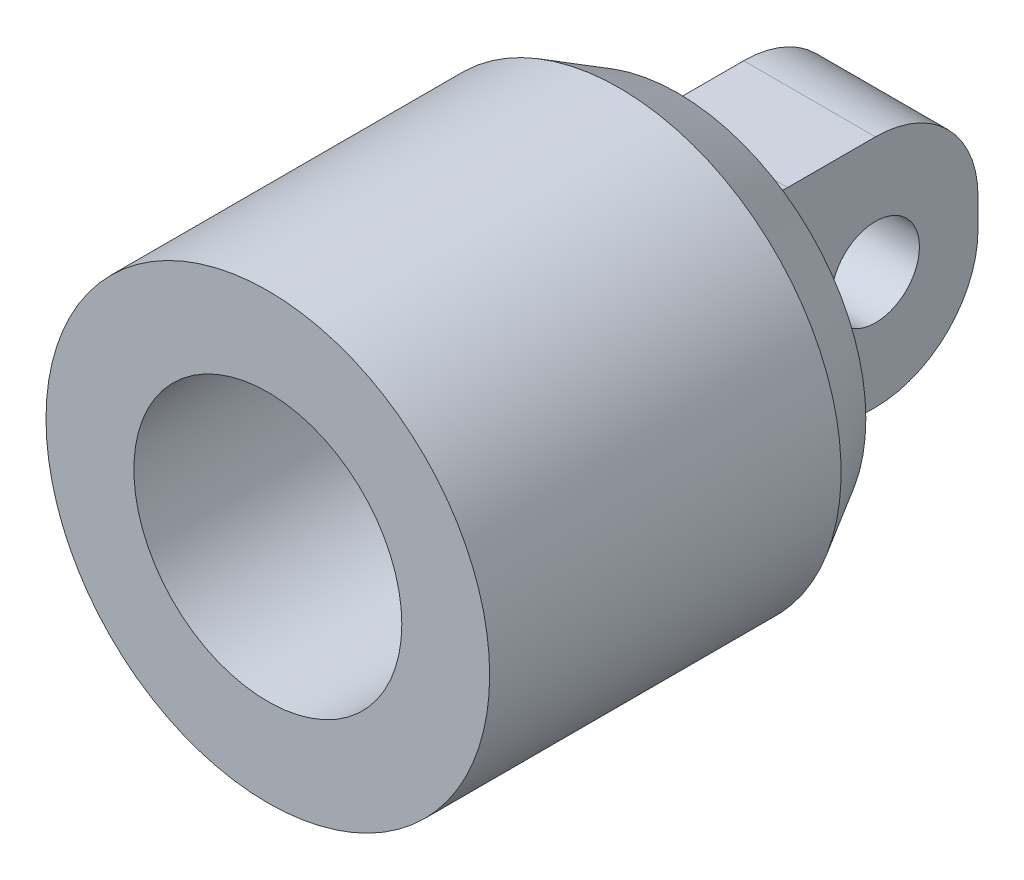
ISO-10303-21;
HEADER;
FILE_DESCRIPTION(('STEP AP214'),'2;1');
FILE_NAME('part.step','',(''),(''),'','','');
FILE_SCHEMA(('AUTOMOTIVE_DESIGN { 1 0 10303 214 1 1 1 1 }'));
ENDSEC;
DATA;
#1=APPLICATION_CONTEXT('core data for automotive mechanical design processes');
#2=APPLICATION_PROTOCOL_DEFINITION('international standard','automotive_design',2000,#1);
#3=PRODUCT_CONTEXT('',#1,'mechanical');
#4=PRODUCT('Part','Part','',(#3));
#5=PRODUCT_RELATED_PRODUCT_CATEGORY('part','',(#4));
#6=PRODUCT_DEFINITION_FORMATION('','',#4);
#7=PRODUCT_DEFINITION_CONTEXT('part definition',#1,'design');
#8=PRODUCT_DEFINITION('design','',#6,#7);
#9=PRODUCT_DEFINITION_SHAPE('','',#8);
#10=(LENGTH_UNIT() NAMED_UNIT(*) SI_UNIT(.MILLI.,.METRE.));
#11=(NAMED_UNIT(*) PLANE_ANGLE_UNIT() SI_UNIT($,.RADIAN.));
#12=(NAMED_UNIT(*) SI_UNIT($,.STERADIAN.) SOLID_ANGLE_UNIT());
#13=UNCERTAINTY_MEASURE_WITH_UNIT(LENGTH_MEASURE(1.E-05),#10,'distance_accuracy_value','');
#14=(GEOMETRIC_REPRESENTATION_CONTEXT(3) GLOBAL_UNCERTAINTY_ASSIGNED_CONTEXT((#13)) GLOBAL_UNIT_ASSIGNED_CONTEXT((#10,
#11,#12)) REPRESENTATION_CONTEXT('',''));
#15=CARTESIAN_POINT('',(0.,0.,0.));
#16=DIRECTION('',(0.,0.,1.));
#17=DIRECTION('',(1.,0.,0.));
#18=AXIS2_PLACEMENT_3D('',#15,#16,#17);
#19=CARTESIAN_POINT('',(0.,0.,-2.));
#20=DIRECTION('',(0.,0.,-1.));
#21=DIRECTION('',(-1.,0.,0.));
#22=AXIS2_PLACEMENT_3D('',#19,#20,#21);
#23=PLANE('',#22);
#24=CARTESIAN_POINT('',(0.,0.,-2.));
#25=DIRECTION('',(0.,0.,-1.));
#26=DIRECTION('',(-1.,0.,0.));
#27=AXIS2_PLACEMENT_3D('',#24,#25,#26);
#28=CIRCLE('',#27,6.42029946162075);
#29=CARTESIAN_POINT('',(-6.42029946162075,0.,-2.));
#30=VERTEX_POINT('',#29);
#31=EDGE_CURVE('E40',#30,#30,#28,.T.);
#32=ORIENTED_EDGE('',*,*,#31,.T.);
#33=EDGE_LOOP('',(#32));
#34=FACE_BOUND('',#33,.T.);
#35=DIRECTION('',(0.,-1.,0.));
#36=VECTOR('',#35,1.);
#37=CARTESIAN_POINT('',(-3.05,-5.5,-2.));
#38=LINE('',#37,#36);
#39=CARTESIAN_POINT('',(-3.05,5.5,-2.));
#40=VERTEX_POINT('',#39);
#41=CARTESIAN_POINT('',(-3.05,-5.5,-2.));
#42=VERTEX_POINT('',#41);
#43=EDGE_CURVE('E191',#40,#42,#38,.T.);
#44=ORIENTED_EDGE('',*,*,#43,.T.);
#45=DIRECTION('',(-1.,0.,0.));
#46=VECTOR('',#45,1.);
#47=CARTESIAN_POINT('',(0.,-5.5,-2.));
#48=LINE('',#47,#46);
#49=CARTESIAN_POINT('',(3.05,-5.5,-2.));
#50=VERTEX_POINT('',#49);
#51=EDGE_CURVE('E177',#42,#50,#48,.F.);
#52=ORIENTED_EDGE('',*,*,#51,.T.);
#53=DIRECTION('',(0.,-1.,0.));
#54=VECTOR('',#53,1.);
#55=CARTESIAN_POINT('',(3.05,0.,-2.));
#56=LINE('',#55,#54);
#57=CARTESIAN_POINT('',(3.05,5.5,-2.));
#58=VERTEX_POINT('',#57);
#59=EDGE_CURVE('E188',#50,#58,#56,.F.);
#60=ORIENTED_EDGE('',*,*,#59,.T.);
#61=DIRECTION('',(-1.,0.,0.));
#62=VECTOR('',#61,1.);
#63=CARTESIAN_POINT('',(0.,5.5,-2.));
#64=LINE('',#63,#62);
#65=EDGE_CURVE('E175',#58,#40,#64,.T.);
#66=ORIENTED_EDGE('',*,*,#65,.T.);
#67=EDGE_LOOP('',(#44,#52,#60,#66));
#68=FACE_BOUND('',#67,.T.);
#69=ADVANCED_FACE('F32',(#34,#68),#23,.T.);
#70=CARTESIAN_POINT('',(0.,0.,12.));
#71=DIRECTION('',(0.,0.,1.));
#72=DIRECTION('',(1.,0.,0.));
#73=AXIS2_PLACEMENT_3D('',#70,#71,#72);
#74=PLANE('',#73);
#75=CARTESIAN_POINT('',(0.,0.,12.));
#76=DIRECTION('',(0.,0.,1.));
#77=DIRECTION('',(1.,0.,0.));
#78=AXIS2_PLACEMENT_3D('',#75,#76,#77);
#79=CIRCLE('',#78,7.575);
#80=CARTESIAN_POINT('',(7.575,0.,12.));
#81=VERTEX_POINT('',#80);
#82=EDGE_CURVE('E133',#81,#81,#79,.T.);
#83=ORIENTED_EDGE('',*,*,#82,.T.);
#84=EDGE_LOOP('',(#83));
#85=FACE_BOUND('',#84,.T.);
#86=CARTESIAN_POINT('',(0.,0.,12.));
#87=DIRECTION('',(0.,0.,1.));
#88=DIRECTION('',(1.,0.,0.));
#89=AXIS2_PLACEMENT_3D('',#86,#87,#88);
#90=CIRCLE('',#89,4.575);
#91=CARTESIAN_POINT('',(4.575,0.,12.));
#92=VERTEX_POINT('',#91);
#93=EDGE_CURVE('E148',#92,#92,#90,.T.);
#94=ORIENTED_EDGE('',*,*,#93,.F.);
#95=EDGE_LOOP('',(#94));
#96=FACE_BOUND('',#95,.T.);
#97=ADVANCED_FACE('F245',(#85,#96),#74,.T.);
#98=CARTESIAN_POINT('',(0.,0.,12.));
#99=DIRECTION('',(0.,0.,-1.));
#100=DIRECTION('',(-1.,0.,0.));
#101=AXIS2_PLACEMENT_3D('',#98,#99,#100);
#102=CYLINDRICAL_SURFACE('',#101,7.575);
#103=CARTESIAN_POINT('',(0.,0.,0.));
#104=DIRECTION('',(0.,0.,-1.));
#105=DIRECTION('',(-1.,0.,0.));
#106=AXIS2_PLACEMENT_3D('',#103,#104,#105);
#107=CIRCLE('',#106,7.575);
#108=CARTESIAN_POINT('',(-7.575,0.,0.));
#109=VERTEX_POINT('',#108);
#110=EDGE_CURVE('E11',#109,#109,#107,.F.);
#111=ORIENTED_EDGE('',*,*,#110,.T.);
#112=EDGE_LOOP('',(#111));
#113=FACE_BOUND('',#112,.T.);
#114=ORIENTED_EDGE('',*,*,#82,.F.);
#115=EDGE_LOOP('',(#114));
#116=FACE_BOUND('',#115,.T.);
#117=ADVANCED_FACE('F251',(#113,#116),#102,.T.);
#118=CARTESIAN_POINT('',(0.,0.,12.));
#119=DIRECTION('',(0.,0.,-1.));
#120=DIRECTION('',(-1.,0.,0.));
#121=AXIS2_PLACEMENT_3D('',#118,#119,#120);
#122=CYLINDRICAL_SURFACE('',#121,4.575);
#123=ORIENTED_EDGE('',*,*,#93,.T.);
#124=EDGE_LOOP('',(#123));
#125=FACE_BOUND('',#124,.T.);
#126=CARTESIAN_POINT('',(0.,0.,0.));
#127=DIRECTION('',(0.,0.,1.));
#128=DIRECTION('',(1.,0.,0.));
#129=AXIS2_PLACEMENT_3D('',#126,#127,#128);
#130=CIRCLE('',#129,4.575);
#131=CARTESIAN_POINT('',(4.575,0.,0.));
#132=VERTEX_POINT('',#131);
#133=EDGE_CURVE('E151',#132,#132,#130,.T.);
#134=ORIENTED_EDGE('',*,*,#133,.F.);
#135=EDGE_LOOP('',(#134));
#136=FACE_BOUND('',#135,.T.);
#137=ADVANCED_FACE('F263',(#125,#136),#122,.F.);
#138=CARTESIAN_POINT('',(0.,0.,0.));
#139=DIRECTION('',(0.,0.,-1.));
#140=DIRECTION('',(-1.,0.,0.));
#141=AXIS2_PLACEMENT_3D('',#138,#139,#140);
#142=PLANE('',#141);
#143=ORIENTED_EDGE('',*,*,#133,.T.);
#144=EDGE_LOOP('',(#143));
#145=FACE_BOUND('',#144,.T.);
#146=ADVANCED_FACE('F260',(#145),#142,.F.);
#147=CARTESIAN_POINT('',(2.25,-4.,-10.));
#148=DIRECTION('',(0.,1.,0.));
#149=DIRECTION('',(0.,0.,1.));
#150=AXIS2_PLACEMENT_3D('',#147,#148,#149);
#151=PLANE('',#150);
#152=DIRECTION('',(0.,0.,-1.));
#153=VECTOR('',#152,1.);
#154=CARTESIAN_POINT('',(2.25,-4.,-10.));
#155=LINE('',#154,#153);
#156=CARTESIAN_POINT('',(2.25,-4.,-3.5));
#157=VERTEX_POINT('',#156);
#158=CARTESIAN_POINT('',(2.25,-4.,-6.5));
#159=VERTEX_POINT('',#158);
#160=EDGE_CURVE('E139',#157,#159,#155,.T.);
#161=ORIENTED_EDGE('',*,*,#160,.F.);
#162=DIRECTION('',(-1.,0.,0.));
#163=VECTOR('',#162,1.);
#164=CARTESIAN_POINT('',(2.25,-4.,-3.5));
#165=LINE('',#164,#163);
#166=CARTESIAN_POINT('',(-2.25,-4.,-3.5));
#167=VERTEX_POINT('',#166);
#168=EDGE_CURVE('E172',#157,#167,#165,.T.);
#169=ORIENTED_EDGE('',*,*,#168,.T.);
#170=DIRECTION('',(0.,0.,-1.));
#171=VECTOR('',#170,1.);
#172=CARTESIAN_POINT('',(-2.25,-4.,-10.));
#173=LINE('',#172,#171);
#174=CARTESIAN_POINT('',(-2.25,-4.,-6.5));
#175=VERTEX_POINT('',#174);
#176=EDGE_CURVE('E144',#167,#175,#173,.T.);
#177=ORIENTED_EDGE('',*,*,#176,.T.);
#178=DIRECTION('',(-1.,0.,0.));
#179=VECTOR('',#178,1.);
#180=CARTESIAN_POINT('',(2.25,-4.,-6.5));
#181=LINE('',#180,#179);
#182=EDGE_CURVE('E169',#175,#159,#181,.F.);
#183=ORIENTED_EDGE('',*,*,#182,.T.);
#184=EDGE_LOOP('',(#161,#169,#177,#183));
#185=FACE_BOUND('',#184,.T.);
#186=ADVANCED_FACE('F258',(#185),#151,.F.);
#187=CARTESIAN_POINT('',(2.25,4.,-10.));
#188=DIRECTION('',(0.,0.,1.));
#189=DIRECTION('',(1.,0.,0.));
#190=AXIS2_PLACEMENT_3D('',#187,#188,#189);
#191=PLANE('',#190);
#192=DIRECTION('',(0.,1.,0.));
#193=VECTOR('',#192,1.);
#194=CARTESIAN_POINT('',(-2.25,4.,-10.));
#195=LINE('',#194,#193);
#196=CARTESIAN_POINT('',(-2.25,-0.5,-10.));
#197=VERTEX_POINT('',#196);
#198=CARTESIAN_POINT('',(-2.25,0.500000000000001,-10.));
#199=VERTEX_POINT('',#198);
#200=EDGE_CURVE('E140',#197,#199,#195,.T.);
#201=ORIENTED_EDGE('',*,*,#200,.T.);
#202=DIRECTION('',(-1.,0.,0.));
#203=VECTOR('',#202,1.);
#204=CARTESIAN_POINT('',(2.25,0.500000000000001,-10.));
#205=LINE('',#204,#203);
#206=CARTESIAN_POINT('',(2.25,0.500000000000001,-10.));
#207=VERTEX_POINT('',#206);
#208=EDGE_CURVE('E117',#199,#207,#205,.F.);
#209=ORIENTED_EDGE('',*,*,#208,.T.);
#210=DIRECTION('',(0.,1.,0.));
#211=VECTOR('',#210,1.);
#212=CARTESIAN_POINT('',(2.25,4.,-10.));
#213=LINE('',#212,#211);
#214=CARTESIAN_POINT('',(2.25,-0.5,-10.));
#215=VERTEX_POINT('',#214);
#216=EDGE_CURVE('E142',#215,#207,#213,.T.);
#217=ORIENTED_EDGE('',*,*,#216,.F.);
#218=DIRECTION('',(-1.,0.,0.));
#219=VECTOR('',#218,1.);
#220=CARTESIAN_POINT('',(2.25,-0.5,-10.));
#221=LINE('',#220,#219);
#222=EDGE_CURVE('E122',#215,#197,#221,.T.);
#223=ORIENTED_EDGE('',*,*,#222,.T.);
#224=EDGE_LOOP('',(#201,#209,#217,#223));
#225=FACE_BOUND('',#224,.T.);
#226=ADVANCED_FACE('F291',(#225),#191,.F.);
#227=CARTESIAN_POINT('',(2.25,4.,-2.));
#228=DIRECTION('',(0.,-1.,0.));
#229=DIRECTION('',(0.,0.,-1.));
#230=AXIS2_PLACEMENT_3D('',#227,#228,#229);
#231=PLANE('',#230);
#232=DIRECTION('',(0.,0.,1.));
#233=VECTOR('',#232,1.);
#234=CARTESIAN_POINT('',(-2.25,4.,-2.));
#235=LINE('',#234,#233);
#236=CARTESIAN_POINT('',(-2.25,4.,-6.5));
#237=VERTEX_POINT('',#236);
#238=CARTESIAN_POINT('',(-2.25,4.,-3.5));
#239=VERTEX_POINT('',#238);
#240=EDGE_CURVE('E129',#237,#239,#235,.T.);
#241=ORIENTED_EDGE('',*,*,#240,.T.);
#242=DIRECTION('',(-1.,0.,0.));
#243=VECTOR('',#242,1.);
#244=CARTESIAN_POINT('',(2.25,4.,-3.5));
#245=LINE('',#244,#243);
#246=CARTESIAN_POINT('',(2.25,4.,-3.5));
#247=VERTEX_POINT('',#246);
#248=EDGE_CURVE('E179',#239,#247,#245,.F.);
#249=ORIENTED_EDGE('',*,*,#248,.T.);
#250=DIRECTION('',(0.,0.,1.));
#251=VECTOR('',#250,1.);
#252=CARTESIAN_POINT('',(2.25,4.,-2.));
#253=LINE('',#252,#251);
#254=CARTESIAN_POINT('',(2.25,4.,-6.5));
#255=VERTEX_POINT('',#254);
#256=EDGE_CURVE('E132',#255,#247,#253,.T.);
#257=ORIENTED_EDGE('',*,*,#256,.F.);
#258=DIRECTION('',(-1.,0.,0.));
#259=VECTOR('',#258,1.);
#260=CARTESIAN_POINT('',(2.25,4.,-6.5));
#261=LINE('',#260,#259);
#262=EDGE_CURVE('E116',#255,#237,#261,.T.);
#263=ORIENTED_EDGE('',*,*,#262,.T.);
#264=EDGE_LOOP('',(#241,#249,#257,#263));
#265=FACE_BOUND('',#264,.T.);
#266=ADVANCED_FACE('F128',(#265),#231,.F.);
#267=CARTESIAN_POINT('',(2.25,0.,0.));
#268=DIRECTION('',(-1.,0.,0.));
#269=DIRECTION('',(0.,0.,1.));
#270=AXIS2_PLACEMENT_3D('',#267,#268,#269);
#271=PLANE('',#270);
#272=CARTESIAN_POINT('',(2.25,0.,-6.5));
#273=DIRECTION('',(1.,0.,0.));
#274=DIRECTION('',(0.,0.,-1.));
#275=AXIS2_PLACEMENT_3D('',#272,#273,#274);
#276=CIRCLE('',#275,1.5);
#277=CARTESIAN_POINT('',(2.25,0.,-8.));
#278=VERTEX_POINT('',#277);
#279=EDGE_CURVE('E158',#278,#278,#276,.T.);
#280=ORIENTED_EDGE('',*,*,#279,.F.);
#281=EDGE_LOOP('',(#280));
#282=FACE_BOUND('',#281,.T.);
#283=CARTESIAN_POINT('',(2.25,5.5,-3.5));
#284=DIRECTION('',(-1.,0.,0.));
#285=DIRECTION('',(0.,0.,1.));
#286=AXIS2_PLACEMENT_3D('',#283,#284,#285);
#287=CIRCLE('',#286,1.5);
#288=CARTESIAN_POINT('',(2.25,4.17335008385784,-2.8));
#289=VERTEX_POINT('',#288);
#290=EDGE_CURVE('E186',#247,#289,#287,.T.);
#291=ORIENTED_EDGE('',*,*,#290,.T.);
#292=DIRECTION('',(0.,-1.,0.));
#293=VECTOR('',#292,1.);
#294=CARTESIAN_POINT('',(2.25,0.,-2.8));
#295=LINE('',#294,#293);
#296=CARTESIAN_POINT('',(2.25,-4.17335008385784,-2.8));
#297=VERTEX_POINT('',#296);
#298=EDGE_CURVE('E196',#289,#297,#295,.T.);
#299=ORIENTED_EDGE('',*,*,#298,.T.);
#300=CARTESIAN_POINT('',(2.25,-5.5,-3.5));
#301=DIRECTION('',(-1.,0.,0.));
#302=DIRECTION('',(0.,0.,1.));
#303=AXIS2_PLACEMENT_3D('',#300,#301,#302);
#304=CIRCLE('',#303,1.5);
#305=EDGE_CURVE('E183',#297,#157,#304,.T.);
#306=ORIENTED_EDGE('',*,*,#305,.T.);
#307=ORIENTED_EDGE('',*,*,#160,.T.);
#308=CARTESIAN_POINT('',(2.25,-0.5,-6.5));
#309=DIRECTION('',(-1.,0.,0.));
#310=DIRECTION('',(0.,0.,1.));
#311=AXIS2_PLACEMENT_3D('',#308,#309,#310);
#312=CIRCLE('',#311,3.5);
#313=EDGE_CURVE('E165',#159,#215,#312,.F.);
#314=ORIENTED_EDGE('',*,*,#313,.T.);
#315=ORIENTED_EDGE('',*,*,#216,.T.);
#316=CARTESIAN_POINT('',(2.25,0.500000000000001,-6.5));
#317=DIRECTION('',(-1.,0.,0.));
#318=DIRECTION('',(0.,0.,1.));
#319=AXIS2_PLACEMENT_3D('',#316,#317,#318);
#320=CIRCLE('',#319,3.5);
#321=EDGE_CURVE('E167',#207,#255,#320,.F.);
#322=ORIENTED_EDGE('',*,*,#321,.T.);
#323=ORIENTED_EDGE('',*,*,#256,.T.);
#324=EDGE_LOOP('',(#291,#299,#306,#307,#314,#315,#322,#323));
#325=FACE_BOUND('',#324,.T.);
#326=ADVANCED_FACE('F282',(#282,#325),#271,.F.);
#327=CARTESIAN_POINT('',(-2.25,0.,0.));
#328=DIRECTION('',(-1.,0.,0.));
#329=DIRECTION('',(0.,0.,1.));
#330=AXIS2_PLACEMENT_3D('',#327,#328,#329);
#331=PLANE('',#330);
#332=CARTESIAN_POINT('',(-2.25,0.,-6.5));
#333=DIRECTION('',(-1.,0.,0.));
#334=DIRECTION('',(0.,0.,1.));
#335=AXIS2_PLACEMENT_3D('',#332,#333,#334);
#336=CIRCLE('',#335,1.5);
#337=CARTESIAN_POINT('',(-2.25,0.,-5.));
#338=VERTEX_POINT('',#337);
#339=EDGE_CURVE('E156',#338,#338,#336,.T.);
#340=ORIENTED_EDGE('',*,*,#339,.F.);
#341=EDGE_LOOP('',(#340));
#342=FACE_BOUND('',#341,.T.);
#343=CARTESIAN_POINT('',(-2.25,-5.5,-3.5));
#344=DIRECTION('',(-1.,0.,0.));
#345=DIRECTION('',(0.,0.,1.));
#346=AXIS2_PLACEMENT_3D('',#343,#344,#345);
#347=CIRCLE('',#346,1.5);
#348=CARTESIAN_POINT('',(-2.25,-4.17335008385784,-2.8));
#349=VERTEX_POINT('',#348);
#350=EDGE_CURVE('E181',#167,#349,#347,.F.);
#351=ORIENTED_EDGE('',*,*,#350,.T.);
#352=DIRECTION('',(0.,-1.,0.));
#353=VECTOR('',#352,1.);
#354=CARTESIAN_POINT('',(-2.25,5.5,-2.8));
#355=LINE('',#354,#353);
#356=CARTESIAN_POINT('',(-2.25,4.17335008385784,-2.8));
#357=VERTEX_POINT('',#356);
#358=EDGE_CURVE('E194',#349,#357,#355,.F.);
#359=ORIENTED_EDGE('',*,*,#358,.T.);
#360=CARTESIAN_POINT('',(-2.25,5.5,-3.5));
#361=DIRECTION('',(-1.,0.,0.));
#362=DIRECTION('',(0.,0.,1.));
#363=AXIS2_PLACEMENT_3D('',#360,#361,#362);
#364=CIRCLE('',#363,1.5);
#365=EDGE_CURVE('E138',#357,#239,#364,.F.);
#366=ORIENTED_EDGE('',*,*,#365,.T.);
#367=ORIENTED_EDGE('',*,*,#240,.F.);
#368=CARTESIAN_POINT('',(-2.25,0.500000000000001,-6.5));
#369=DIRECTION('',(-1.,0.,0.));
#370=DIRECTION('',(0.,0.,1.));
#371=AXIS2_PLACEMENT_3D('',#368,#369,#370);
#372=CIRCLE('',#371,3.5);
#373=EDGE_CURVE('E112',#237,#199,#372,.T.);
#374=ORIENTED_EDGE('',*,*,#373,.T.);
#375=ORIENTED_EDGE('',*,*,#200,.F.);
#376=CARTESIAN_POINT('',(-2.25,-0.5,-6.5));
#377=DIRECTION('',(-1.,0.,0.));
#378=DIRECTION('',(0.,0.,1.));
#379=AXIS2_PLACEMENT_3D('',#376,#377,#378);
#380=CIRCLE('',#379,3.5);
#381=EDGE_CURVE('E123',#197,#175,#380,.T.);
#382=ORIENTED_EDGE('',*,*,#381,.T.);
#383=ORIENTED_EDGE('',*,*,#176,.F.);
#384=EDGE_LOOP('',(#351,#359,#366,#367,#374,#375,#382,#383));
#385=FACE_BOUND('',#384,.T.);
#386=ADVANCED_FACE('F136',(#342,#385),#331,.T.);
#387=CARTESIAN_POINT('',(-7.575,0.,-6.5));
#388=DIRECTION('',(1.,0.,0.));
#389=DIRECTION('',(0.,0.,-1.));
#390=AXIS2_PLACEMENT_3D('',#387,#388,#389);
#391=CYLINDRICAL_SURFACE('',#390,1.5);
#392=ORIENTED_EDGE('',*,*,#339,.T.);
#393=EDGE_LOOP('',(#392));
#394=FACE_BOUND('',#393,.T.);
#395=ORIENTED_EDGE('',*,*,#279,.T.);
#396=EDGE_LOOP('',(#395));
#397=FACE_BOUND('',#396,.T.);
#398=ADVANCED_FACE('F271',(#394,#397),#391,.F.);
#399=CARTESIAN_POINT('',(2.25,0.500000000000001,-6.5));
#400=DIRECTION('',(-1.,0.,0.));
#401=DIRECTION('',(0.,0.,1.));
#402=AXIS2_PLACEMENT_3D('',#399,#400,#401);
#403=CYLINDRICAL_SURFACE('',#402,3.5);
#404=ORIENTED_EDGE('',*,*,#321,.F.);
#405=ORIENTED_EDGE('',*,*,#208,.F.);
#406=ORIENTED_EDGE('',*,*,#373,.F.);
#407=ORIENTED_EDGE('',*,*,#262,.F.);
#408=EDGE_LOOP('',(#404,#405,#406,#407));
#409=FACE_BOUND('',#408,.T.);
#410=ADVANCED_FACE('F115',(#409),#403,.T.);
#411=CARTESIAN_POINT('',(2.25,-0.5,-6.5));
#412=DIRECTION('',(-1.,0.,0.));
#413=DIRECTION('',(0.,0.,1.));
#414=AXIS2_PLACEMENT_3D('',#411,#412,#413);
#415=CYLINDRICAL_SURFACE('',#414,3.5);
#416=ORIENTED_EDGE('',*,*,#313,.F.);
#417=ORIENTED_EDGE('',*,*,#182,.F.);
#418=ORIENTED_EDGE('',*,*,#381,.F.);
#419=ORIENTED_EDGE('',*,*,#222,.F.);
#420=EDGE_LOOP('',(#416,#417,#418,#419));
#421=FACE_BOUND('',#420,.T.);
#422=ADVANCED_FACE('F220',(#421),#415,.T.);
#423=CARTESIAN_POINT('',(2.25,-5.5,-3.5));
#424=DIRECTION('',(-1.,0.,0.));
#425=DIRECTION('',(0.,0.,1.));
#426=AXIS2_PLACEMENT_3D('',#423,#424,#425);
#427=CYLINDRICAL_SURFACE('',#426,1.5);
#428=ORIENTED_EDGE('',*,*,#305,.F.);
#429=CARTESIAN_POINT('',(2.25,-4.17335008385784,-2.8));
#430=CARTESIAN_POINT('',(2.24999970846345,-4.18653906857599,-2.77499444108757));
#431=CARTESIAN_POINT('',(2.25117201737374,-4.2004300415766,-2.75039082358349));
#432=CARTESIAN_POINT('',(2.25563441343226,-4.22945817422937,-2.70218375675026));
#433=CARTESIAN_POINT('',(2.25892083972887,-4.24459314031614,-2.67857865353232));
#434=CARTESIAN_POINT('',(2.27152694613575,-4.29136262622054,-2.60992263431384));
#435=CARTESIAN_POINT('',(2.28360353892915,-4.32465089762547,-2.56648780286273));
#436=CARTESIAN_POINT('',(2.31795752867752,-4.40504616907569,-2.47239308749919));
#437=CARTESIAN_POINT('',(2.34220676928859,-4.45330596117375,-2.42346526488911));
#438=CARTESIAN_POINT('',(2.39757026672099,-4.55390009328018,-2.33404225581291));
#439=CARTESIAN_POINT('',(2.42872066481805,-4.60625490870792,-2.2935937301803));
#440=CARTESIAN_POINT('',(2.50935008352192,-4.73544693607746,-2.20625760601271));
#441=CARTESIAN_POINT('',(2.56113209177665,-4.81358440602729,-2.16343721989299));
#442=CARTESIAN_POINT('',(2.67000954596476,-4.97273604374257,-2.09302820798627));
#443=CARTESIAN_POINT('',(2.72710454589373,-5.05374996968856,-2.06543830500659));
#444=CARTESIAN_POINT('',(2.82795474250742,-5.1947295535853,-2.03012403237722));
#445=CARTESIAN_POINT('',(2.87105782349024,-5.25435322473934,-2.01902241366479));
#446=CARTESIAN_POINT('',(2.95792485726329,-5.37391137822492,-2.00409787590262));
#447=CARTESIAN_POINT('',(3.00168757598934,-5.43384516875054,-2.00026274069123));
#448=CARTESIAN_POINT('',(3.04695448378584,-5.49582975400963,-2.00000435120864));
#449=CARTESIAN_POINT('',(3.04847726127759,-5.49791490289666,-2.00000000385586));
#450=CARTESIAN_POINT('',(3.05,-5.5,-2.));
#451=B_SPLINE_CURVE_WITH_KNOTS('',3,(#429,#430,#431,#432,#433,#434,#435,#436,#437,#438,#439,
#440,#441,#442,#443,#444,#445,#446,#447,#448,#449,#450),.UNSPECIFIED.,.F.,.F.,(4,2,2,2,2,2,2,2,
2,2,4),(0.,0.084730965607158,0.16931560274699,0.336665682299699,0.554135768414899,
0.772772859277625,1.08029328658109,1.38778792202223,1.61067470146313,1.83318643770084,
1.84093241537538),.UNSPECIFIED.);
#452=EDGE_CURVE('E47',#297,#50,#451,.T.);
#453=ORIENTED_EDGE('',*,*,#452,.T.);
#454=ORIENTED_EDGE('',*,*,#51,.F.);
#455=CARTESIAN_POINT('',(-2.25,-4.17335008385784,-2.8));
#456=CARTESIAN_POINT('',(-2.24999970846345,-4.18653906857599,-2.77499444108757));
#457=CARTESIAN_POINT('',(-2.25117201737374,-4.2004300415766,-2.75039082358349));
#458=CARTESIAN_POINT('',(-2.25563441343226,-4.22945817422937,-2.70218375675026));
#459=CARTESIAN_POINT('',(-2.25892083972887,-4.24459314031614,-2.67857865353232));
#460=CARTESIAN_POINT('',(-2.27152694613575,-4.29136262622054,-2.60992263431384));
#461=CARTESIAN_POINT('',(-2.28360353892915,-4.32465089762547,-2.56648780286273));
#462=CARTESIAN_POINT('',(-2.31795752867752,-4.40504616907569,-2.47239308749919));
#463=CARTESIAN_POINT('',(-2.34220676928859,-4.45330596117375,-2.42346526488911));
#464=CARTESIAN_POINT('',(-2.39757026672099,-4.55390009328018,-2.33404225581291));
#465=CARTESIAN_POINT('',(-2.42872066481805,-4.60625490870792,-2.2935937301803));
#466=CARTESIAN_POINT('',(-2.50935008352192,-4.73544693607746,-2.20625760601271));
#467=CARTESIAN_POINT('',(-2.56113209177665,-4.81358440602729,-2.16343721989299));
#468=CARTESIAN_POINT('',(-2.67000954596476,-4.97273604374257,-2.09302820798627));
#469=CARTESIAN_POINT('',(-2.72710454589373,-5.05374996968856,-2.06543830500659));
#470=CARTESIAN_POINT('',(-2.82795474250742,-5.1947295535853,-2.03012403237722));
#471=CARTESIAN_POINT('',(-2.87105782349024,-5.25435322473934,-2.01902241366479));
#472=CARTESIAN_POINT('',(-2.95792485726329,-5.37391137822492,-2.00409787590262));
#473=CARTESIAN_POINT('',(-3.00168757598934,-5.43384516875054,-2.00026274069123));
#474=CARTESIAN_POINT('',(-3.04695448378584,-5.49582975400963,-2.00000435120864));
#475=CARTESIAN_POINT('',(-3.04847726127759,-5.49791490289666,-2.00000000385586));
#476=CARTESIAN_POINT('',(-3.05,-5.5,-2.));
#477=B_SPLINE_CURVE_WITH_KNOTS('',3,(#455,#456,#457,#458,#459,#460,#461,#462,#463,#464,#465,
#466,#467,#468,#469,#470,#471,#472,#473,#474,#475,#476),.UNSPECIFIED.,.F.,.F.,(4,2,2,2,2,2,2,2,
2,2,4),(0.,0.084730965607158,0.16931560274699,0.336665682299699,0.554135768414899,
0.772772859277625,1.08029328658109,1.38778792202223,1.61067470146313,1.83318643770084,
1.84093241537538),.UNSPECIFIED.);
#478=EDGE_CURVE('E198',#42,#349,#477,.F.);
#479=ORIENTED_EDGE('',*,*,#478,.T.);
#480=ORIENTED_EDGE('',*,*,#350,.F.);
#481=ORIENTED_EDGE('',*,*,#168,.F.);
#482=EDGE_LOOP('',(#428,#453,#454,#479,#480,#481));
#483=FACE_BOUND('',#482,.T.);
#484=ADVANCED_FACE('F215',(#483),#427,.F.);
#485=CARTESIAN_POINT('',(0.,5.5,-3.5));
#486=DIRECTION('',(-1.,0.,0.));
#487=DIRECTION('',(0.,0.,1.));
#488=AXIS2_PLACEMENT_3D('',#485,#486,#487);
#489=CYLINDRICAL_SURFACE('',#488,1.5);
#490=ORIENTED_EDGE('',*,*,#290,.F.);
#491=ORIENTED_EDGE('',*,*,#248,.F.);
#492=ORIENTED_EDGE('',*,*,#365,.F.);
#493=CARTESIAN_POINT('',(-2.25,4.17335008385784,-2.8));
#494=CARTESIAN_POINT('',(-2.24999970846345,4.18653906857599,-2.77499444108757));
#495=CARTESIAN_POINT('',(-2.25117201737374,4.2004300415766,-2.75039082358349));
#496=CARTESIAN_POINT('',(-2.25563441343226,4.22945817422937,-2.70218375675027));
#497=CARTESIAN_POINT('',(-2.25892083972887,4.24459314031614,-2.67857865353232));
#498=CARTESIAN_POINT('',(-2.27152694613575,4.29136262622054,-2.60992263431385));
#499=CARTESIAN_POINT('',(-2.28360353892915,4.32465089762547,-2.56648780286274));
#500=CARTESIAN_POINT('',(-2.31795752867752,4.40504616907569,-2.47239308749919));
#501=CARTESIAN_POINT('',(-2.3422067692886,4.45330596117375,-2.4234652648891));
#502=CARTESIAN_POINT('',(-2.39757026672099,4.55390009328018,-2.33404225581291));
#503=CARTESIAN_POINT('',(-2.42872066481805,4.60625490870793,-2.2935937301803));
#504=CARTESIAN_POINT('',(-2.50935008352192,4.73544693607746,-2.20625760601271));
#505=CARTESIAN_POINT('',(-2.56113209177666,4.81358440602728,-2.16343721989299));
#506=CARTESIAN_POINT('',(-2.67000954596474,4.97273604374258,-2.09302820798627));
#507=CARTESIAN_POINT('',(-2.72710454589367,5.0537499696886,-2.06543830500659));
#508=CARTESIAN_POINT('',(-2.82795474250746,5.19472955358527,-2.03012403237722));
#509=CARTESIAN_POINT('',(-2.87105782349038,5.25435322473924,-2.01902241366479));
#510=CARTESIAN_POINT('',(-2.95792485726316,5.37391137822502,-2.00409787590262));
#511=CARTESIAN_POINT('',(-3.00168757598886,5.43384516875089,-2.00026274069122));
#512=CARTESIAN_POINT('',(-3.0469544837858,5.49582975400966,-2.00000435120864));
#513=CARTESIAN_POINT('',(-3.04847726127757,5.49791490289667,-2.00000000385586));
#514=CARTESIAN_POINT('',(-3.05,5.5,-2.));
#515=B_SPLINE_CURVE_WITH_KNOTS('',3,(#493,#494,#495,#496,#497,#498,#499,#500,#501,#502,#503,
#504,#505,#506,#507,#508,#509,#510,#511,#512,#513,#514),.UNSPECIFIED.,.F.,.F.,(4,2,2,2,2,2,2,2,
2,2,4),(0.,0.0847309656071548,0.169315602746985,0.336665682299699,0.554135768414904,
0.772772859277626,1.08029328658108,1.38778792202223,1.61067470146314,1.83318643770084,
1.84093241537538),.UNSPECIFIED.);
#516=EDGE_CURVE('E206',#357,#40,#515,.T.);
#517=ORIENTED_EDGE('',*,*,#516,.T.);
#518=ORIENTED_EDGE('',*,*,#65,.F.);
#519=CARTESIAN_POINT('',(2.25,4.17335008385784,-2.8));
#520=CARTESIAN_POINT('',(2.24999970846345,4.18653906857599,-2.77499444108757));
#521=CARTESIAN_POINT('',(2.25117201737374,4.2004300415766,-2.75039082358349));
#522=CARTESIAN_POINT('',(2.25563441343226,4.22945817422937,-2.70218375675027));
#523=CARTESIAN_POINT('',(2.25892083972887,4.24459314031614,-2.67857865353232));
#524=CARTESIAN_POINT('',(2.27152694613575,4.29136262622054,-2.60992263431385));
#525=CARTESIAN_POINT('',(2.28360353892915,4.32465089762547,-2.56648780286274));
#526=CARTESIAN_POINT('',(2.31795752867752,4.40504616907569,-2.47239308749919));
#527=CARTESIAN_POINT('',(2.3422067692886,4.45330596117375,-2.4234652648891));
#528=CARTESIAN_POINT('',(2.39757026672099,4.55390009328018,-2.33404225581291));
#529=CARTESIAN_POINT('',(2.42872066481805,4.60625490870793,-2.2935937301803));
#530=CARTESIAN_POINT('',(2.50935008352192,4.73544693607746,-2.20625760601271));
#531=CARTESIAN_POINT('',(2.56113209177666,4.81358440602728,-2.16343721989299));
#532=CARTESIAN_POINT('',(2.67000954596474,4.97273604374258,-2.09302820798627));
#533=CARTESIAN_POINT('',(2.72710454589367,5.0537499696886,-2.06543830500659));
#534=CARTESIAN_POINT('',(2.82795474250746,5.19472955358527,-2.03012403237722));
#535=CARTESIAN_POINT('',(2.87105782349038,5.25435322473924,-2.01902241366479));
#536=CARTESIAN_POINT('',(2.95792485726316,5.37391137822502,-2.00409787590262));
#537=CARTESIAN_POINT('',(3.00168757598886,5.43384516875089,-2.00026274069122));
#538=CARTESIAN_POINT('',(3.0469544837858,5.49582975400966,-2.00000435120864));
#539=CARTESIAN_POINT('',(3.04847726127757,5.49791490289667,-2.00000000385586));
#540=CARTESIAN_POINT('',(3.05,5.5,-2.));
#541=B_SPLINE_CURVE_WITH_KNOTS('',3,(#519,#520,#521,#522,#523,#524,#525,#526,#527,#528,#529,
#530,#531,#532,#533,#534,#535,#536,#537,#538,#539,#540),.UNSPECIFIED.,.F.,.F.,(4,2,2,2,2,2,2,2,
2,2,4),(0.,0.0847309656071548,0.169315602746985,0.336665682299699,0.554135768414904,
0.772772859277626,1.08029328658108,1.38778792202223,1.61067470146314,1.83318643770084,
1.84093241537538),.UNSPECIFIED.);
#542=EDGE_CURVE('E55',#58,#289,#541,.F.);
#543=ORIENTED_EDGE('',*,*,#542,.T.);
#544=EDGE_LOOP('',(#490,#491,#492,#517,#518,#543));
#545=FACE_BOUND('',#544,.T.);
#546=ADVANCED_FACE('F219',(#545),#489,.F.);
#547=CARTESIAN_POINT('',(-3.05,0.,-2.8));
#548=DIRECTION('',(0.,1.,0.));
#549=DIRECTION('',(0.,0.,1.));
#550=AXIS2_PLACEMENT_3D('',#547,#548,#549);
#551=CYLINDRICAL_SURFACE('',#550,0.8);
#552=ORIENTED_EDGE('',*,*,#516,.F.);
#553=ORIENTED_EDGE('',*,*,#358,.F.);
#554=ORIENTED_EDGE('',*,*,#478,.F.);
#555=ORIENTED_EDGE('',*,*,#43,.F.);
#556=EDGE_LOOP('',(#552,#553,#554,#555));
#557=FACE_BOUND('',#556,.T.);
#558=ADVANCED_FACE('F213',(#557),#551,.F.);
#559=CARTESIAN_POINT('',(3.05,0.,-2.8));
#560=DIRECTION('',(0.,-1.,0.));
#561=DIRECTION('',(0.,0.,-1.));
#562=AXIS2_PLACEMENT_3D('',#559,#560,#561);
#563=CYLINDRICAL_SURFACE('',#562,0.8);
#564=ORIENTED_EDGE('',*,*,#542,.F.);
#565=ORIENTED_EDGE('',*,*,#59,.F.);
#566=ORIENTED_EDGE('',*,*,#452,.F.);
#567=ORIENTED_EDGE('',*,*,#298,.F.);
#568=EDGE_LOOP('',(#564,#565,#566,#567));
#569=FACE_BOUND('',#568,.T.);
#570=ADVANCED_FACE('F234',(#569),#563,.F.);
#571=CARTESIAN_POINT('',(0.,0.,-2.));
#572=DIRECTION('',(0.,0.,1.));
#573=DIRECTION('',(1.,0.,0.));
#574=AXIS2_PLACEMENT_3D('',#571,#572,#573);
#575=CONICAL_SURFACE('',#574,6.42029946162075,0.523598775598296);
#576=ORIENTED_EDGE('',*,*,#110,.F.);
#577=EDGE_LOOP('',(#576));
#578=FACE_BOUND('',#577,.T.);
#579=ORIENTED_EDGE('',*,*,#31,.F.);
#580=EDGE_LOOP('',(#579));
#581=FACE_BOUND('',#580,.T.);
#582=ADVANCED_FACE('F34',(#578,#581),#575,.T.);
#583=CLOSED_SHELL('',(#69,#97,#117,#137,#146,#186,#226,#266,#326,#386,#398,#410,#422,#484,#546,
#558,#570,#582));
#584=MANIFOLD_SOLID_BREP('B2',#583);
#585=ADVANCED_BREP_SHAPE_REPRESENTATION('',(#18,#584),#14);
#586=SHAPE_DEFINITION_REPRESENTATION(#9,#585);
ENDSEC;
END-ISO-10303-21;
